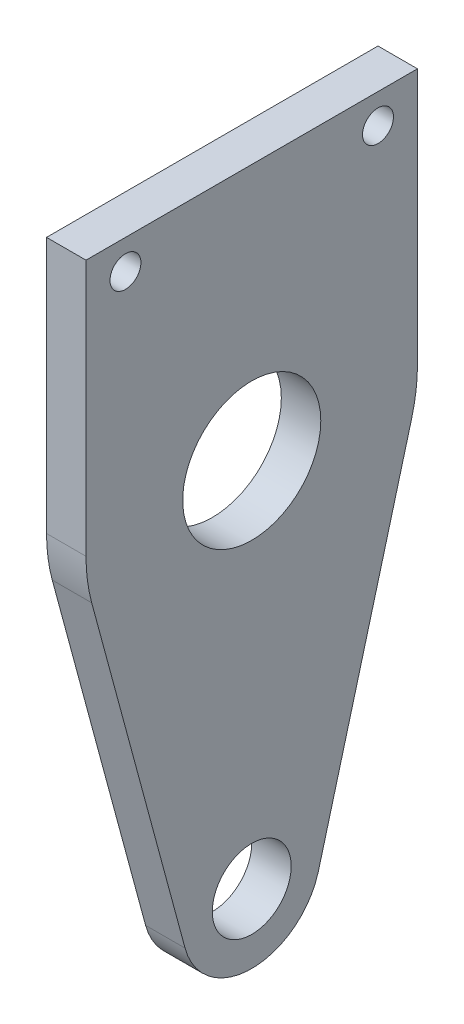
ISO-10303-21;
HEADER;
FILE_DESCRIPTION(('STEP AP214'),'2;1');
FILE_NAME('part.step','',(''),(''),'','','');
FILE_SCHEMA(('AUTOMOTIVE_DESIGN { 1 0 10303 214 1 1 1 1 }'));
ENDSEC;
DATA;
#1=APPLICATION_CONTEXT('core data for automotive mechanical design processes');
#2=APPLICATION_PROTOCOL_DEFINITION('international standard','automotive_design',2000,#1);
#3=PRODUCT_CONTEXT('',#1,'mechanical');
#4=PRODUCT('Part','Part','',(#3));
#5=PRODUCT_RELATED_PRODUCT_CATEGORY('part','',(#4));
#6=PRODUCT_DEFINITION_FORMATION('','',#4);
#7=PRODUCT_DEFINITION_CONTEXT('part definition',#1,'design');
#8=PRODUCT_DEFINITION('design','',#6,#7);
#9=PRODUCT_DEFINITION_SHAPE('','',#8);
#10=(LENGTH_UNIT() NAMED_UNIT(*) SI_UNIT(.MILLI.,.METRE.));
#11=(NAMED_UNIT(*) PLANE_ANGLE_UNIT() SI_UNIT($,.RADIAN.));
#12=(NAMED_UNIT(*) SI_UNIT($,.STERADIAN.) SOLID_ANGLE_UNIT());
#13=UNCERTAINTY_MEASURE_WITH_UNIT(LENGTH_MEASURE(1.E-05),#10,'distance_accuracy_value','');
#14=(GEOMETRIC_REPRESENTATION_CONTEXT(3) GLOBAL_UNCERTAINTY_ASSIGNED_CONTEXT((#13)) GLOBAL_UNIT_ASSIGNED_CONTEXT((#10,
#11,#12)) REPRESENTATION_CONTEXT('',''));
#15=CARTESIAN_POINT('',(0.,0.,0.));
#16=DIRECTION('',(0.,0.,1.));
#17=DIRECTION('',(1.,0.,0.));
#18=AXIS2_PLACEMENT_3D('',#15,#16,#17);
#19=CARTESIAN_POINT('',(6.35,-2.89634308510638,-10.7284133488301));
#20=DIRECTION('',(0.,-0.26063829787234,-0.965436521829483));
#21=DIRECTION('',(0.,0.965436521829483,-0.260638297872341));
#22=AXIS2_PLACEMENT_3D('',#19,#20,#21);
#23=PLANE('',#22);
#24=DIRECTION('',(0.,-0.965436521829483,0.260638297872341));
#25=VECTOR('',#24,1.);
#26=CARTESIAN_POINT('',(0.,-2.89634308510638,-10.7284133488301));
#27=LINE('',#26,#25);
#28=CARTESIAN_POINT('',(0.,52.7387765957447,-25.7481920371923));
#29=VERTEX_POINT('',#28);
#30=CARTESIAN_POINT('',(0.,-2.89634308510638,-10.7284133488301));
#31=VERTEX_POINT('',#30);
#32=EDGE_CURVE('E142',#29,#31,#27,.T.);
#33=ORIENTED_EDGE('',*,*,#32,.F.);
#34=DIRECTION('',(-1.,0.,0.));
#35=VECTOR('',#34,1.);
#36=CARTESIAN_POINT('',(6.35,52.7387765957447,-25.7481920371923));
#37=LINE('',#36,#35);
#38=CARTESIAN_POINT('',(6.35,52.7387765957447,-25.7481920371923));
#39=VERTEX_POINT('',#38);
#40=EDGE_CURVE('E11',#39,#29,#37,.T.);
#41=ORIENTED_EDGE('',*,*,#40,.F.);
#42=DIRECTION('',(0.,-0.965436521829483,0.260638297872341));
#43=VECTOR('',#42,1.);
#44=CARTESIAN_POINT('',(6.35,-2.89634308510638,-10.7284133488301));
#45=LINE('',#44,#43);
#46=CARTESIAN_POINT('',(6.35,-2.89634308510638,-10.7284133488301));
#47=VERTEX_POINT('',#46);
#48=EDGE_CURVE('E168',#39,#47,#45,.T.);
#49=ORIENTED_EDGE('',*,*,#48,.T.);
#50=DIRECTION('',(-1.,0.,0.));
#51=VECTOR('',#50,1.);
#52=CARTESIAN_POINT('',(6.35,-2.89634308510638,-10.7284133488301));
#53=LINE('',#52,#51);
#54=EDGE_CURVE('E89',#47,#31,#53,.T.);
#55=ORIENTED_EDGE('',*,*,#54,.T.);
#56=EDGE_LOOP('',(#33,#41,#49,#55));
#57=FACE_BOUND('',#56,.T.);
#58=ADVANCED_FACE('F39',(#57),#23,.T.);
#59=CARTESIAN_POINT('',(6.35,59.69,0.));
#60=DIRECTION('',(-1.,0.,0.));
#61=DIRECTION('',(0.,0.,1.));
#62=AXIS2_PLACEMENT_3D('',#59,#60,#61);
#63=CYLINDRICAL_SURFACE('',#62,26.67);
#64=CARTESIAN_POINT('',(0.,59.69,0.));
#65=DIRECTION('',(1.,0.,0.));
#66=DIRECTION('',(0.,0.,-1.));
#67=AXIS2_PLACEMENT_3D('',#64,#65,#66);
#68=CIRCLE('',#67,26.67);
#69=CARTESIAN_POINT('',(0.,59.69,-26.67));
#70=VERTEX_POINT('',#69);
#71=EDGE_CURVE('E145',#29,#70,#68,.T.);
#72=ORIENTED_EDGE('',*,*,#71,.T.);
#73=DIRECTION('',(-1.,0.,0.));
#74=VECTOR('',#73,1.);
#75=CARTESIAN_POINT('',(6.35,59.69,-26.67));
#76=LINE('',#75,#74);
#77=CARTESIAN_POINT('',(6.35,59.69,-26.67));
#78=VERTEX_POINT('',#77);
#79=EDGE_CURVE('E47',#78,#70,#76,.T.);
#80=ORIENTED_EDGE('',*,*,#79,.F.);
#81=CARTESIAN_POINT('',(6.35,59.69,0.));
#82=DIRECTION('',(1.,0.,0.));
#83=DIRECTION('',(0.,0.,-1.));
#84=AXIS2_PLACEMENT_3D('',#81,#82,#83);
#85=CIRCLE('',#84,26.67);
#86=EDGE_CURVE('E119',#39,#78,#85,.T.);
#87=ORIENTED_EDGE('',*,*,#86,.F.);
#88=ORIENTED_EDGE('',*,*,#40,.T.);
#89=EDGE_LOOP('',(#72,#80,#87,#88));
#90=FACE_BOUND('',#89,.T.);
#91=ADVANCED_FACE('F184',(#90),#63,.T.);
#92=CARTESIAN_POINT('',(6.35,0.,-26.67));
#93=DIRECTION('',(0.,0.,-1.));
#94=DIRECTION('',(-1.,0.,0.));
#95=AXIS2_PLACEMENT_3D('',#92,#93,#94);
#96=PLANE('',#95);
#97=DIRECTION('',(0.,-1.,0.));
#98=VECTOR('',#97,1.);
#99=CARTESIAN_POINT('',(0.,0.,-26.67));
#100=LINE('',#99,#98);
#101=CARTESIAN_POINT('',(0.,100.96397257,-26.67));
#102=VERTEX_POINT('',#101);
#103=EDGE_CURVE('E149',#102,#70,#100,.T.);
#104=ORIENTED_EDGE('',*,*,#103,.F.);
#105=DIRECTION('',(-1.,0.,0.));
#106=VECTOR('',#105,1.);
#107=CARTESIAN_POINT('',(6.35,100.96397257,-26.67));
#108=LINE('',#107,#106);
#109=CARTESIAN_POINT('',(6.35,100.96397257,-26.67));
#110=VERTEX_POINT('',#109);
#111=EDGE_CURVE('E174',#110,#102,#108,.T.);
#112=ORIENTED_EDGE('',*,*,#111,.F.);
#113=DIRECTION('',(0.,-1.,0.));
#114=VECTOR('',#113,1.);
#115=CARTESIAN_POINT('',(6.35,0.,-26.67));
#116=LINE('',#115,#114);
#117=EDGE_CURVE('E181',#110,#78,#116,.T.);
#118=ORIENTED_EDGE('',*,*,#117,.T.);
#119=ORIENTED_EDGE('',*,*,#79,.T.);
#120=EDGE_LOOP('',(#104,#112,#118,#119));
#121=FACE_BOUND('',#120,.T.);
#122=ADVANCED_FACE('F179',(#121),#96,.T.);
#123=CARTESIAN_POINT('',(6.35,100.96397257,0.));
#124=DIRECTION('',(0.,1.,0.));
#125=DIRECTION('',(0.,0.,1.));
#126=AXIS2_PLACEMENT_3D('',#123,#124,#125);
#127=PLANE('',#126);
#128=DIRECTION('',(0.,0.,-1.));
#129=VECTOR('',#128,1.);
#130=CARTESIAN_POINT('',(0.,100.96397257,0.));
#131=LINE('',#130,#129);
#132=CARTESIAN_POINT('',(0.,100.96397257,26.67));
#133=VERTEX_POINT('',#132);
#134=EDGE_CURVE('E152',#133,#102,#131,.T.);
#135=ORIENTED_EDGE('',*,*,#134,.F.);
#136=DIRECTION('',(-1.,0.,0.));
#137=VECTOR('',#136,1.);
#138=CARTESIAN_POINT('',(6.35,100.96397257,26.67));
#139=LINE('',#138,#137);
#140=CARTESIAN_POINT('',(6.35,100.96397257,26.67));
#141=VERTEX_POINT('',#140);
#142=EDGE_CURVE('E172',#141,#133,#139,.T.);
#143=ORIENTED_EDGE('',*,*,#142,.F.);
#144=DIRECTION('',(0.,0.,-1.));
#145=VECTOR('',#144,1.);
#146=CARTESIAN_POINT('',(6.35,100.96397257,0.));
#147=LINE('',#146,#145);
#148=EDGE_CURVE('E193',#141,#110,#147,.T.);
#149=ORIENTED_EDGE('',*,*,#148,.T.);
#150=ORIENTED_EDGE('',*,*,#111,.T.);
#151=EDGE_LOOP('',(#135,#143,#149,#150));
#152=FACE_BOUND('',#151,.T.);
#153=ADVANCED_FACE('F191',(#152),#127,.T.);
#154=CARTESIAN_POINT('',(6.35,0.,26.67));
#155=DIRECTION('',(0.,0.,1.));
#156=DIRECTION('',(0.,-1.,0.));
#157=AXIS2_PLACEMENT_3D('',#154,#155,#156);
#158=PLANE('',#157);
#159=DIRECTION('',(0.,1.,0.));
#160=VECTOR('',#159,1.);
#161=CARTESIAN_POINT('',(0.,0.,26.67));
#162=LINE('',#161,#160);
#163=CARTESIAN_POINT('',(0.,59.69,26.67));
#164=VERTEX_POINT('',#163);
#165=EDGE_CURVE('E155',#164,#133,#162,.T.);
#166=ORIENTED_EDGE('',*,*,#165,.F.);
#167=DIRECTION('',(-1.,0.,0.));
#168=VECTOR('',#167,1.);
#169=CARTESIAN_POINT('',(6.35,59.69,26.67));
#170=LINE('',#169,#168);
#171=CARTESIAN_POINT('',(6.35,59.69,26.67));
#172=VERTEX_POINT('',#171);
#173=EDGE_CURVE('E128',#172,#164,#170,.T.);
#174=ORIENTED_EDGE('',*,*,#173,.F.);
#175=DIRECTION('',(0.,1.,0.));
#176=VECTOR('',#175,1.);
#177=CARTESIAN_POINT('',(6.35,0.,26.67));
#178=LINE('',#177,#176);
#179=EDGE_CURVE('E116',#172,#141,#178,.T.);
#180=ORIENTED_EDGE('',*,*,#179,.T.);
#181=ORIENTED_EDGE('',*,*,#142,.T.);
#182=EDGE_LOOP('',(#166,#174,#180,#181));
#183=FACE_BOUND('',#182,.T.);
#184=ADVANCED_FACE('F249',(#183),#158,.T.);
#185=CARTESIAN_POINT('',(0.,52.7387765957447,25.7481920371923));
#186=VERTEX_POINT('',#185);
#187=EDGE_CURVE('E124',#164,#186,#68,.T.);
#188=ORIENTED_EDGE('',*,*,#187,.T.);
#189=DIRECTION('',(-1.,0.,0.));
#190=VECTOR('',#189,1.);
#191=CARTESIAN_POINT('',(6.35,52.7387765957447,25.7481920371923));
#192=LINE('',#191,#190);
#193=CARTESIAN_POINT('',(6.35,52.7387765957447,25.7481920371923));
#194=VERTEX_POINT('',#193);
#195=EDGE_CURVE('E121',#194,#186,#192,.T.);
#196=ORIENTED_EDGE('',*,*,#195,.F.);
#197=EDGE_CURVE('E108',#172,#194,#85,.T.);
#198=ORIENTED_EDGE('',*,*,#197,.F.);
#199=ORIENTED_EDGE('',*,*,#173,.T.);
#200=EDGE_LOOP('',(#188,#196,#198,#199));
#201=FACE_BOUND('',#200,.T.);
#202=ADVANCED_FACE('F122',(#201),#63,.T.);
#203=CARTESIAN_POINT('',(6.35,-2.89634308510638,10.7284133488301));
#204=DIRECTION('',(0.,-0.26063829787234,0.965436521829483));
#205=DIRECTION('',(0.,-0.965436521829483,-0.26063829787234));
#206=AXIS2_PLACEMENT_3D('',#203,#204,#205);
#207=PLANE('',#206);
#208=DIRECTION('',(0.,0.965436521829483,0.26063829787234));
#209=VECTOR('',#208,1.);
#210=CARTESIAN_POINT('',(0.,-2.89634308510638,10.7284133488301));
#211=LINE('',#210,#209);
#212=CARTESIAN_POINT('',(0.,-2.89634308510638,10.7284133488301));
#213=VERTEX_POINT('',#212);
#214=EDGE_CURVE('E158',#213,#186,#211,.T.);
#215=ORIENTED_EDGE('',*,*,#214,.F.);
#216=DIRECTION('',(-1.,0.,0.));
#217=VECTOR('',#216,1.);
#218=CARTESIAN_POINT('',(6.35,-2.89634308510638,10.7284133488301));
#219=LINE('',#218,#217);
#220=CARTESIAN_POINT('',(6.35,-2.89634308510638,10.7284133488301));
#221=VERTEX_POINT('',#220);
#222=EDGE_CURVE('E82',#221,#213,#219,.T.);
#223=ORIENTED_EDGE('',*,*,#222,.F.);
#224=DIRECTION('',(0.,0.965436521829483,0.26063829787234));
#225=VECTOR('',#224,1.);
#226=CARTESIAN_POINT('',(6.35,-2.89634308510638,10.7284133488301));
#227=LINE('',#226,#225);
#228=EDGE_CURVE('E113',#221,#194,#227,.T.);
#229=ORIENTED_EDGE('',*,*,#228,.T.);
#230=ORIENTED_EDGE('',*,*,#195,.T.);
#231=EDGE_LOOP('',(#215,#223,#229,#230));
#232=FACE_BOUND('',#231,.T.);
#233=ADVANCED_FACE('F130',(#232),#207,.T.);
#234=CARTESIAN_POINT('',(6.35,0.,0.));
#235=DIRECTION('',(-1.,0.,0.));
#236=DIRECTION('',(0.,0.,1.));
#237=AXIS2_PLACEMENT_3D('',#234,#235,#236);
#238=CYLINDRICAL_SURFACE('',#237,6.35);
#239=CARTESIAN_POINT('',(6.35,0.,0.));
#240=DIRECTION('',(1.,0.,0.));
#241=DIRECTION('',(0.,0.,-1.));
#242=AXIS2_PLACEMENT_3D('',#239,#240,#241);
#243=CIRCLE('',#242,6.35);
#244=CARTESIAN_POINT('',(6.35,0.,-6.35));
#245=VERTEX_POINT('',#244);
#246=EDGE_CURVE('E132',#245,#245,#243,.T.);
#247=ORIENTED_EDGE('',*,*,#246,.T.);
#248=EDGE_LOOP('',(#247));
#249=FACE_BOUND('',#248,.T.);
#250=CARTESIAN_POINT('',(0.,0.,0.));
#251=DIRECTION('',(1.,0.,0.));
#252=DIRECTION('',(0.,0.,-1.));
#253=AXIS2_PLACEMENT_3D('',#250,#251,#252);
#254=CIRCLE('',#253,6.35);
#255=CARTESIAN_POINT('',(0.,0.,-6.35));
#256=VERTEX_POINT('',#255);
#257=EDGE_CURVE('E162',#256,#256,#254,.T.);
#258=ORIENTED_EDGE('',*,*,#257,.F.);
#259=EDGE_LOOP('',(#258));
#260=FACE_BOUND('',#259,.T.);
#261=ADVANCED_FACE('F235',(#249,#260),#238,.F.);
#262=CARTESIAN_POINT('',(6.35,0.,0.));
#263=DIRECTION('',(-1.,0.,0.));
#264=DIRECTION('',(0.,0.,1.));
#265=AXIS2_PLACEMENT_3D('',#262,#263,#264);
#266=CYLINDRICAL_SURFACE('',#265,11.1125);
#267=CARTESIAN_POINT('',(0.,0.,0.));
#268=DIRECTION('',(1.,0.,0.));
#269=DIRECTION('',(0.,0.,-1.));
#270=AXIS2_PLACEMENT_3D('',#267,#268,#269);
#271=CIRCLE('',#270,11.1125);
#272=EDGE_CURVE('E160',#213,#31,#271,.T.);
#273=ORIENTED_EDGE('',*,*,#272,.T.);
#274=ORIENTED_EDGE('',*,*,#54,.F.);
#275=CARTESIAN_POINT('',(6.35,0.,0.));
#276=DIRECTION('',(1.,0.,0.));
#277=DIRECTION('',(0.,0.,-1.));
#278=AXIS2_PLACEMENT_3D('',#275,#276,#277);
#279=CIRCLE('',#278,11.1125);
#280=EDGE_CURVE('E55',#221,#47,#279,.T.);
#281=ORIENTED_EDGE('',*,*,#280,.F.);
#282=ORIENTED_EDGE('',*,*,#222,.T.);
#283=EDGE_LOOP('',(#273,#274,#281,#282));
#284=FACE_BOUND('',#283,.T.);
#285=ADVANCED_FACE('F232',(#284),#266,.T.);
#286=CARTESIAN_POINT('',(6.35,59.69,0.));
#287=DIRECTION('',(-1.,0.,0.));
#288=DIRECTION('',(0.,0.,1.));
#289=AXIS2_PLACEMENT_3D('',#286,#287,#288);
#290=CYLINDRICAL_SURFACE('',#289,11.1125);
#291=CARTESIAN_POINT('',(6.35,59.69,0.));
#292=DIRECTION('',(1.,0.,0.));
#293=DIRECTION('',(0.,0.,-1.));
#294=AXIS2_PLACEMENT_3D('',#291,#292,#293);
#295=CIRCLE('',#294,11.1125);
#296=CARTESIAN_POINT('',(6.35,59.69,-11.1125));
#297=VERTEX_POINT('',#296);
#298=EDGE_CURVE('E139',#297,#297,#295,.T.);
#299=ORIENTED_EDGE('',*,*,#298,.T.);
#300=EDGE_LOOP('',(#299));
#301=FACE_BOUND('',#300,.T.);
#302=CARTESIAN_POINT('',(0.,59.69,0.));
#303=DIRECTION('',(1.,0.,0.));
#304=DIRECTION('',(0.,0.,-1.));
#305=AXIS2_PLACEMENT_3D('',#302,#303,#304);
#306=CIRCLE('',#305,11.1125);
#307=CARTESIAN_POINT('',(0.,59.69,-11.1125));
#308=VERTEX_POINT('',#307);
#309=EDGE_CURVE('E165',#308,#308,#306,.T.);
#310=ORIENTED_EDGE('',*,*,#309,.F.);
#311=EDGE_LOOP('',(#310));
#312=FACE_BOUND('',#311,.T.);
#313=ADVANCED_FACE('F234',(#301,#312),#290,.F.);
#314=CARTESIAN_POINT('',(6.35,0.,0.));
#315=DIRECTION('',(1.,0.,0.));
#316=DIRECTION('',(0.,0.,-1.));
#317=AXIS2_PLACEMENT_3D('',#314,#315,#316);
#318=PLANE('',#317);
#319=CARTESIAN_POINT('',(6.35,96.20147257,20.32));
#320=DIRECTION('',(-1.,0.,0.));
#321=DIRECTION('',(0.,0.,1.));
#322=AXIS2_PLACEMENT_3D('',#319,#320,#321);
#323=CIRCLE('',#322,2.4892);
#324=CARTESIAN_POINT('',(6.35,96.20147257,22.8092));
#325=VERTEX_POINT('',#324);
#326=EDGE_CURVE('E202',#325,#325,#323,.T.);
#327=ORIENTED_EDGE('',*,*,#326,.T.);
#328=EDGE_LOOP('',(#327));
#329=FACE_BOUND('',#328,.T.);
#330=CARTESIAN_POINT('',(6.35,96.20147257,-20.32));
#331=DIRECTION('',(-1.,0.,0.));
#332=DIRECTION('',(0.,0.,1.));
#333=AXIS2_PLACEMENT_3D('',#330,#331,#332);
#334=CIRCLE('',#333,2.4892);
#335=CARTESIAN_POINT('',(6.35,96.20147257,-17.8308));
#336=VERTEX_POINT('',#335);
#337=EDGE_CURVE('E146',#336,#336,#334,.T.);
#338=ORIENTED_EDGE('',*,*,#337,.T.);
#339=EDGE_LOOP('',(#338));
#340=FACE_BOUND('',#339,.T.);
#341=ORIENTED_EDGE('',*,*,#48,.F.);
#342=ORIENTED_EDGE('',*,*,#86,.T.);
#343=ORIENTED_EDGE('',*,*,#117,.F.);
#344=ORIENTED_EDGE('',*,*,#148,.F.);
#345=ORIENTED_EDGE('',*,*,#179,.F.);
#346=ORIENTED_EDGE('',*,*,#197,.T.);
#347=ORIENTED_EDGE('',*,*,#228,.F.);
#348=ORIENTED_EDGE('',*,*,#280,.T.);
#349=EDGE_LOOP('',(#341,#342,#343,#344,#345,#346,#347,#348));
#350=FACE_BOUND('',#349,.T.);
#351=ORIENTED_EDGE('',*,*,#246,.F.);
#352=EDGE_LOOP('',(#351));
#353=FACE_BOUND('',#352,.T.);
#354=ORIENTED_EDGE('',*,*,#298,.F.);
#355=EDGE_LOOP('',(#354));
#356=FACE_BOUND('',#355,.T.);
#357=ADVANCED_FACE('F110',(#329,#340,#350,#353,#356),#318,.T.);
#358=CARTESIAN_POINT('',(0.,0.,0.));
#359=DIRECTION('',(1.,0.,0.));
#360=DIRECTION('',(0.,0.,-1.));
#361=AXIS2_PLACEMENT_3D('',#358,#359,#360);
#362=PLANE('',#361);
#363=CARTESIAN_POINT('',(0.,96.20147257,20.32));
#364=DIRECTION('',(-1.,0.,0.));
#365=DIRECTION('',(0.,0.,1.));
#366=AXIS2_PLACEMENT_3D('',#363,#364,#365);
#367=CIRCLE('',#366,2.4892);
#368=CARTESIAN_POINT('',(0.,96.20147257,22.8092));
#369=VERTEX_POINT('',#368);
#370=EDGE_CURVE('E205',#369,#369,#367,.T.);
#371=ORIENTED_EDGE('',*,*,#370,.F.);
#372=EDGE_LOOP('',(#371));
#373=FACE_BOUND('',#372,.T.);
#374=CARTESIAN_POINT('',(0.,96.20147257,-20.32));
#375=DIRECTION('',(-1.,0.,0.));
#376=DIRECTION('',(0.,0.,1.));
#377=AXIS2_PLACEMENT_3D('',#374,#375,#376);
#378=CIRCLE('',#377,2.4892);
#379=CARTESIAN_POINT('',(0.,96.20147257,-17.8308));
#380=VERTEX_POINT('',#379);
#381=EDGE_CURVE('E199',#380,#380,#378,.T.);
#382=ORIENTED_EDGE('',*,*,#381,.F.);
#383=EDGE_LOOP('',(#382));
#384=FACE_BOUND('',#383,.T.);
#385=ORIENTED_EDGE('',*,*,#32,.T.);
#386=ORIENTED_EDGE('',*,*,#272,.F.);
#387=ORIENTED_EDGE('',*,*,#214,.T.);
#388=ORIENTED_EDGE('',*,*,#187,.F.);
#389=ORIENTED_EDGE('',*,*,#165,.T.);
#390=ORIENTED_EDGE('',*,*,#134,.T.);
#391=ORIENTED_EDGE('',*,*,#103,.T.);
#392=ORIENTED_EDGE('',*,*,#71,.F.);
#393=EDGE_LOOP('',(#385,#386,#387,#388,#389,#390,#391,#392));
#394=FACE_BOUND('',#393,.T.);
#395=ORIENTED_EDGE('',*,*,#257,.T.);
#396=EDGE_LOOP('',(#395));
#397=FACE_BOUND('',#396,.T.);
#398=ORIENTED_EDGE('',*,*,#309,.T.);
#399=EDGE_LOOP('',(#398));
#400=FACE_BOUND('',#399,.T.);
#401=ADVANCED_FACE('F186',(#373,#384,#394,#397,#400),#362,.F.);
#402=CARTESIAN_POINT('',(0.,96.20147257,-20.32));
#403=DIRECTION('',(-1.,0.,0.));
#404=DIRECTION('',(0.,0.,1.));
#405=AXIS2_PLACEMENT_3D('',#402,#403,#404);
#406=CYLINDRICAL_SURFACE('',#405,2.4892);
#407=ORIENTED_EDGE('',*,*,#337,.F.);
#408=EDGE_LOOP('',(#407));
#409=FACE_BOUND('',#408,.T.);
#410=ORIENTED_EDGE('',*,*,#381,.T.);
#411=EDGE_LOOP('',(#410));
#412=FACE_BOUND('',#411,.T.);
#413=ADVANCED_FACE('F213',(#409,#412),#406,.F.);
#414=CARTESIAN_POINT('',(0.,96.20147257,20.32));
#415=DIRECTION('',(-1.,0.,0.));
#416=DIRECTION('',(0.,0.,1.));
#417=AXIS2_PLACEMENT_3D('',#414,#415,#416);
#418=CYLINDRICAL_SURFACE('',#417,2.4892);
#419=ORIENTED_EDGE('',*,*,#326,.F.);
#420=EDGE_LOOP('',(#419));
#421=FACE_BOUND('',#420,.T.);
#422=ORIENTED_EDGE('',*,*,#370,.T.);
#423=EDGE_LOOP('',(#422));
#424=FACE_BOUND('',#423,.T.);
#425=ADVANCED_FACE('F209',(#421,#424),#418,.F.);
#426=CLOSED_SHELL('',(#58,#91,#122,#153,#184,#202,#233,#261,#285,#313,#357,#401,#413,#425));
#427=MANIFOLD_SOLID_BREP('B2',#426);
#428=ADVANCED_BREP_SHAPE_REPRESENTATION('',(#18,#427),#14);
#429=SHAPE_DEFINITION_REPRESENTATION(#9,#428);
ENDSEC;
END-ISO-10303-21;
